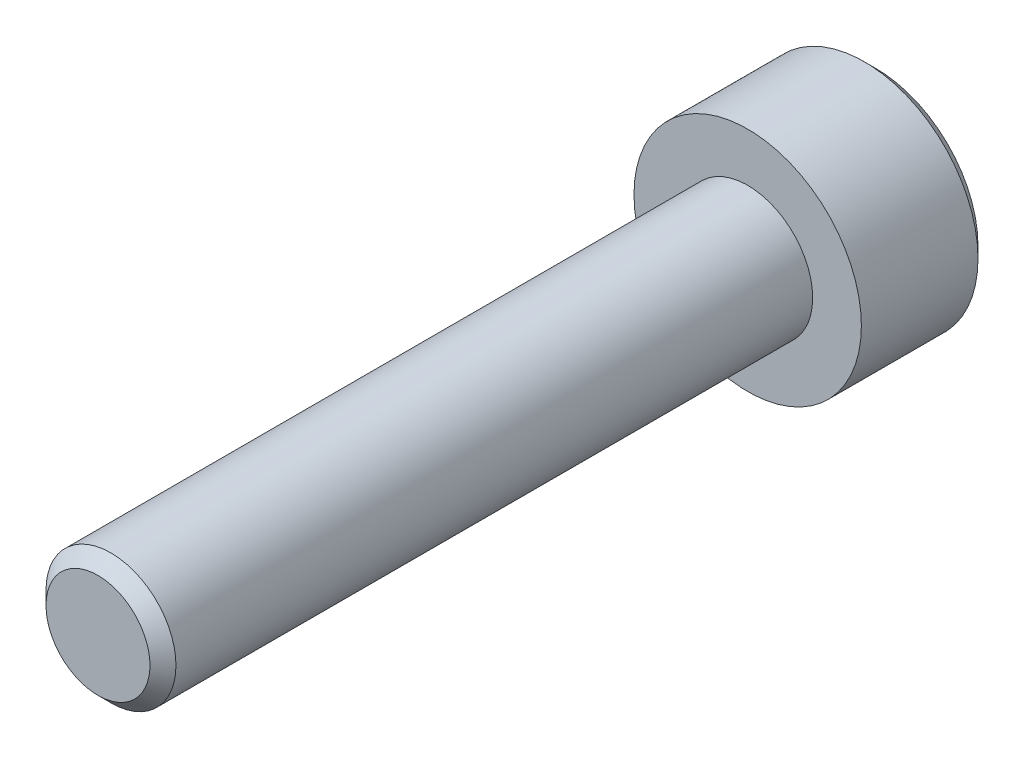
ISO-10303-21;
HEADER;
FILE_DESCRIPTION(('STEP AP214'),'2;1');
FILE_NAME('part.step','',(''),(''),'','','');
FILE_SCHEMA(('AUTOMOTIVE_DESIGN { 1 0 10303 214 1 1 1 1 }'));
ENDSEC;
DATA;
#1=APPLICATION_CONTEXT('core data for automotive mechanical design processes');
#2=APPLICATION_PROTOCOL_DEFINITION('international standard','automotive_design',2000,#1);
#3=PRODUCT_CONTEXT('',#1,'mechanical');
#4=PRODUCT('Part','Part','',(#3));
#5=PRODUCT_RELATED_PRODUCT_CATEGORY('part','',(#4));
#6=PRODUCT_DEFINITION_FORMATION('','',#4);
#7=PRODUCT_DEFINITION_CONTEXT('part definition',#1,'design');
#8=PRODUCT_DEFINITION('design','',#6,#7);
#9=PRODUCT_DEFINITION_SHAPE('','',#8);
#10=(LENGTH_UNIT() NAMED_UNIT(*) SI_UNIT(.MILLI.,.METRE.));
#11=(NAMED_UNIT(*) PLANE_ANGLE_UNIT() SI_UNIT($,.RADIAN.));
#12=(NAMED_UNIT(*) SI_UNIT($,.STERADIAN.) SOLID_ANGLE_UNIT());
#13=UNCERTAINTY_MEASURE_WITH_UNIT(LENGTH_MEASURE(1.E-05),#10,'distance_accuracy_value','');
#14=(GEOMETRIC_REPRESENTATION_CONTEXT(3) GLOBAL_UNCERTAINTY_ASSIGNED_CONTEXT((#13)) GLOBAL_UNIT_ASSIGNED_CONTEXT((#10,
#11,#12)) REPRESENTATION_CONTEXT('',''));
#15=CARTESIAN_POINT('',(0.,0.,0.));
#16=DIRECTION('',(0.,0.,1.));
#17=DIRECTION('',(1.,0.,0.));
#18=AXIS2_PLACEMENT_3D('',#15,#16,#17);
#19=CARTESIAN_POINT('',(0.,1.73205080756888,-3.94));
#20=DIRECTION('',(0.5,0.866025403784439,0.));
#21=DIRECTION('',(-0.866025403784439,0.5,0.));
#22=AXIS2_PLACEMENT_3D('',#19,#20,#21);
#23=PLANE('',#22);
#24=DIRECTION('',(-0.866025403784439,0.5,0.));
#25=VECTOR('',#24,1.);
#26=CARTESIAN_POINT('',(0.,1.73205080756888,-1.94));
#27=LINE('',#26,#25);
#28=CARTESIAN_POINT('',(0.,1.73205080756888,-1.94));
#29=VERTEX_POINT('',#28);
#30=CARTESIAN_POINT('',(1.5,0.86602540378444,-1.94));
#31=VERTEX_POINT('',#30);
#32=EDGE_CURVE('E66',#29,#31,#27,.F.);
#33=ORIENTED_EDGE('',*,*,#32,.F.);
#34=DIRECTION('',(0.,0.,1.));
#35=VECTOR('',#34,1.);
#36=CARTESIAN_POINT('',(0.,1.73205080756888,-3.94));
#37=LINE('',#36,#35);
#38=CARTESIAN_POINT('',(0.,1.73205080756888,-3.94));
#39=VERTEX_POINT('',#38);
#40=EDGE_CURVE('E87',#29,#39,#37,.F.);
#41=ORIENTED_EDGE('',*,*,#40,.T.);
#42=DIRECTION('',(-0.866025403784439,0.5,0.));
#43=VECTOR('',#42,1.);
#44=CARTESIAN_POINT('',(0.,1.73205080756888,-3.94));
#45=LINE('',#44,#43);
#46=CARTESIAN_POINT('',(1.5,0.866025403784439,-3.94));
#47=VERTEX_POINT('',#46);
#48=EDGE_CURVE('E75',#47,#39,#45,.T.);
#49=ORIENTED_EDGE('',*,*,#48,.F.);
#50=DIRECTION('',(0.,0.,-1.));
#51=VECTOR('',#50,1.);
#52=CARTESIAN_POINT('',(1.5,0.866025403784438,-3.94));
#53=LINE('',#52,#51);
#54=EDGE_CURVE('E82',#47,#31,#53,.F.);
#55=ORIENTED_EDGE('',*,*,#54,.T.);
#56=EDGE_LOOP('',(#33,#41,#49,#55));
#57=FACE_BOUND('',#56,.T.);
#58=ADVANCED_FACE('F17',(#57),#23,.F.);
#59=CARTESIAN_POINT('',(1.5,0.866025403784438,-3.94));
#60=DIRECTION('',(1.,0.,0.));
#61=DIRECTION('',(0.,0.,-1.));
#62=AXIS2_PLACEMENT_3D('',#59,#60,#61);
#63=PLANE('',#62);
#64=DIRECTION('',(0.,1.,0.));
#65=VECTOR('',#64,1.);
#66=CARTESIAN_POINT('',(1.5,0.866025403784438,-1.94));
#67=LINE('',#66,#65);
#68=CARTESIAN_POINT('',(1.5,-0.866025403784438,-1.94));
#69=VERTEX_POINT('',#68);
#70=EDGE_CURVE('E92',#31,#69,#67,.F.);
#71=ORIENTED_EDGE('',*,*,#70,.F.);
#72=ORIENTED_EDGE('',*,*,#54,.F.);
#73=DIRECTION('',(0.,1.,0.));
#74=VECTOR('',#73,1.);
#75=CARTESIAN_POINT('',(1.5,0.866025403784438,-3.94));
#76=LINE('',#75,#74);
#77=CARTESIAN_POINT('',(1.5,-0.866025403784438,-3.94));
#78=VERTEX_POINT('',#77);
#79=EDGE_CURVE('E71',#78,#47,#76,.T.);
#80=ORIENTED_EDGE('',*,*,#79,.F.);
#81=DIRECTION('',(0.,0.,1.));
#82=VECTOR('',#81,1.);
#83=CARTESIAN_POINT('',(1.5,-0.866025403784438,-3.94));
#84=LINE('',#83,#82);
#85=EDGE_CURVE('E154',#78,#69,#84,.T.);
#86=ORIENTED_EDGE('',*,*,#85,.T.);
#87=EDGE_LOOP('',(#71,#72,#80,#86));
#88=FACE_BOUND('',#87,.T.);
#89=ADVANCED_FACE('F91',(#88),#63,.F.);
#90=CARTESIAN_POINT('',(-1.5,0.866025403784438,-3.94));
#91=DIRECTION('',(-0.5,0.866025403784439,0.));
#92=DIRECTION('',(-0.866025403784439,-0.5,0.));
#93=AXIS2_PLACEMENT_3D('',#90,#91,#92);
#94=PLANE('',#93);
#95=DIRECTION('',(-0.866025403784438,-0.500000000000001,0.));
#96=VECTOR('',#95,1.);
#97=CARTESIAN_POINT('',(0.,1.73205080756888,-1.94));
#98=LINE('',#97,#96);
#99=CARTESIAN_POINT('',(-1.5,0.866025403784438,-1.94));
#100=VERTEX_POINT('',#99);
#101=EDGE_CURVE('E147',#29,#100,#98,.T.);
#102=ORIENTED_EDGE('',*,*,#101,.T.);
#103=DIRECTION('',(0.,0.,1.));
#104=VECTOR('',#103,1.);
#105=CARTESIAN_POINT('',(-1.5,0.866025403784438,-3.94));
#106=LINE('',#105,#104);
#107=CARTESIAN_POINT('',(-1.5,0.866025403784438,-3.94));
#108=VERTEX_POINT('',#107);
#109=EDGE_CURVE('E137',#100,#108,#106,.F.);
#110=ORIENTED_EDGE('',*,*,#109,.T.);
#111=DIRECTION('',(-0.866025403784439,-0.5,0.));
#112=VECTOR('',#111,1.);
#113=CARTESIAN_POINT('',(-1.5,0.866025403784438,-3.94));
#114=LINE('',#113,#112);
#115=EDGE_CURVE('E99',#39,#108,#114,.T.);
#116=ORIENTED_EDGE('',*,*,#115,.F.);
#117=ORIENTED_EDGE('',*,*,#40,.F.);
#118=EDGE_LOOP('',(#102,#110,#116,#117));
#119=FACE_BOUND('',#118,.T.);
#120=ADVANCED_FACE('F163',(#119),#94,.F.);
#121=CARTESIAN_POINT('',(1.5,-0.866025403784438,-3.94));
#122=DIRECTION('',(0.499999999999999,-0.866025403784439,0.));
#123=DIRECTION('',(0.866025403784439,0.499999999999999,0.));
#124=AXIS2_PLACEMENT_3D('',#121,#122,#123);
#125=PLANE('',#124);
#126=DIRECTION('',(0.866025403784438,0.500000000000001,0.));
#127=VECTOR('',#126,1.);
#128=CARTESIAN_POINT('',(0.,-1.73205080756888,-1.94));
#129=LINE('',#128,#127);
#130=CARTESIAN_POINT('',(0.,-1.73205080756888,-1.94));
#131=VERTEX_POINT('',#130);
#132=EDGE_CURVE('E150',#131,#69,#129,.T.);
#133=ORIENTED_EDGE('',*,*,#132,.T.);
#134=ORIENTED_EDGE('',*,*,#85,.F.);
#135=DIRECTION('',(0.866025403784439,0.499999999999999,0.));
#136=VECTOR('',#135,1.);
#137=CARTESIAN_POINT('',(1.5,-0.866025403784438,-3.94));
#138=LINE('',#137,#136);
#139=CARTESIAN_POINT('',(0.,-1.73205080756888,-3.94));
#140=VERTEX_POINT('',#139);
#141=EDGE_CURVE('E36',#140,#78,#138,.T.);
#142=ORIENTED_EDGE('',*,*,#141,.F.);
#143=DIRECTION('',(0.,0.,1.));
#144=VECTOR('',#143,1.);
#145=CARTESIAN_POINT('',(0.,-1.73205080756888,-3.94));
#146=LINE('',#145,#144);
#147=EDGE_CURVE('E134',#140,#131,#146,.T.);
#148=ORIENTED_EDGE('',*,*,#147,.T.);
#149=EDGE_LOOP('',(#133,#134,#142,#148));
#150=FACE_BOUND('',#149,.T.);
#151=ADVANCED_FACE('F172',(#150),#125,.F.);
#152=CARTESIAN_POINT('',(0.,0.,-1.94));
#153=DIRECTION('',(0.,0.,1.));
#154=DIRECTION('',(1.,0.,0.));
#155=AXIS2_PLACEMENT_3D('',#152,#153,#154);
#156=PLANE('',#155);
#157=ORIENTED_EDGE('',*,*,#101,.F.);
#158=ORIENTED_EDGE('',*,*,#32,.T.);
#159=ORIENTED_EDGE('',*,*,#70,.T.);
#160=ORIENTED_EDGE('',*,*,#132,.F.);
#161=DIRECTION('',(0.866025403784438,-0.5,0.));
#162=VECTOR('',#161,1.);
#163=CARTESIAN_POINT('',(0.,-1.73205080756888,-1.94));
#164=LINE('',#163,#162);
#165=CARTESIAN_POINT('',(-1.5,-0.866025403784439,-1.94));
#166=VERTEX_POINT('',#165);
#167=EDGE_CURVE('E131',#131,#166,#164,.F.);
#168=ORIENTED_EDGE('',*,*,#167,.T.);
#169=DIRECTION('',(0.,1.,0.));
#170=VECTOR('',#169,1.);
#171=CARTESIAN_POINT('',(-1.5,-0.866025403784438,-1.94));
#172=LINE('',#171,#170);
#173=EDGE_CURVE('E141',#166,#100,#172,.T.);
#174=ORIENTED_EDGE('',*,*,#173,.T.);
#175=EDGE_LOOP('',(#157,#158,#159,#160,#168,#174));
#176=FACE_BOUND('',#175,.T.);
#177=ADVANCED_FACE('F173',(#176),#156,.F.);
#178=CARTESIAN_POINT('',(-1.5,-0.866025403784438,-3.94));
#179=DIRECTION('',(-1.,0.,0.));
#180=DIRECTION('',(0.,0.,1.));
#181=AXIS2_PLACEMENT_3D('',#178,#179,#180);
#182=PLANE('',#181);
#183=ORIENTED_EDGE('',*,*,#173,.F.);
#184=DIRECTION('',(0.,0.,1.));
#185=VECTOR('',#184,1.);
#186=CARTESIAN_POINT('',(-1.5,-0.86602540378444,-3.94));
#187=LINE('',#186,#185);
#188=CARTESIAN_POINT('',(-1.5,-0.866025403784439,-3.94));
#189=VERTEX_POINT('',#188);
#190=EDGE_CURVE('E128',#166,#189,#187,.F.);
#191=ORIENTED_EDGE('',*,*,#190,.T.);
#192=DIRECTION('',(0.,1.,0.));
#193=VECTOR('',#192,1.);
#194=CARTESIAN_POINT('',(-1.5,-0.866025403784438,-3.94));
#195=LINE('',#194,#193);
#196=EDGE_CURVE('E145',#108,#189,#195,.F.);
#197=ORIENTED_EDGE('',*,*,#196,.F.);
#198=ORIENTED_EDGE('',*,*,#109,.F.);
#199=EDGE_LOOP('',(#183,#191,#197,#198));
#200=FACE_BOUND('',#199,.T.);
#201=ADVANCED_FACE('F166',(#200),#182,.F.);
#202=CARTESIAN_POINT('',(0.,-1.73205080756888,-3.94));
#203=DIRECTION('',(-0.5,-0.866025403784438,0.));
#204=DIRECTION('',(0.866025403784438,-0.5,0.));
#205=AXIS2_PLACEMENT_3D('',#202,#203,#204);
#206=PLANE('',#205);
#207=ORIENTED_EDGE('',*,*,#167,.F.);
#208=ORIENTED_EDGE('',*,*,#147,.F.);
#209=DIRECTION('',(-0.866025403784438,0.500000000000002,0.));
#210=VECTOR('',#209,1.);
#211=CARTESIAN_POINT('',(0.,-1.73205080756888,-3.94));
#212=LINE('',#211,#210);
#213=EDGE_CURVE('E122',#140,#189,#212,.T.);
#214=ORIENTED_EDGE('',*,*,#213,.T.);
#215=ORIENTED_EDGE('',*,*,#190,.F.);
#216=EDGE_LOOP('',(#207,#208,#214,#215));
#217=FACE_BOUND('',#216,.T.);
#218=ADVANCED_FACE('F170',(#217),#206,.F.);
#219=CARTESIAN_POINT('',(0.,0.,-3.94));
#220=DIRECTION('',(0.,0.,1.));
#221=DIRECTION('',(1.,0.,0.));
#222=AXIS2_PLACEMENT_3D('',#219,#220,#221);
#223=PLANE('',#222);
#224=ORIENTED_EDGE('',*,*,#141,.T.);
#225=ORIENTED_EDGE('',*,*,#79,.T.);
#226=ORIENTED_EDGE('',*,*,#48,.T.);
#227=ORIENTED_EDGE('',*,*,#115,.T.);
#228=ORIENTED_EDGE('',*,*,#196,.T.);
#229=ORIENTED_EDGE('',*,*,#213,.F.);
#230=EDGE_LOOP('',(#224,#225,#226,#227,#228,#229));
#231=FACE_BOUND('',#230,.T.);
#232=CARTESIAN_POINT('',(0.,0.,-3.9400000000569));
#233=DIRECTION('',(0.,0.,1.));
#234=DIRECTION('',(1.,0.,0.));
#235=AXIS2_PLACEMENT_3D('',#232,#233,#234);
#236=CIRCLE('',#235,3.14999999994825);
#237=CARTESIAN_POINT('',(3.14999999994825,0.,-3.9400000000569));
#238=VERTEX_POINT('',#237);
#239=EDGE_CURVE('E20',#238,#238,#236,.T.);
#240=ORIENTED_EDGE('',*,*,#239,.F.);
#241=EDGE_LOOP('',(#240));
#242=FACE_BOUND('',#241,.T.);
#243=ADVANCED_FACE('F73',(#231,#242),#223,.F.);
#244=CARTESIAN_POINT('',(0.,0.,-3.59000000003107));
#245=DIRECTION('',(0.,0.,1.));
#246=DIRECTION('',(1.,0.,0.));
#247=AXIS2_PLACEMENT_3D('',#244,#245,#246);
#248=CONICAL_SURFACE('',#247,3.49999999997408,0.785398163397448);
#249=ORIENTED_EDGE('',*,*,#239,.T.);
#250=EDGE_LOOP('',(#249));
#251=FACE_BOUND('',#250,.T.);
#252=CARTESIAN_POINT('',(0.,0.,-3.59));
#253=DIRECTION('',(0.,0.,1.));
#254=DIRECTION('',(1.,0.,0.));
#255=AXIS2_PLACEMENT_3D('',#252,#253,#254);
#256=CIRCLE('',#255,3.5);
#257=CARTESIAN_POINT('',(3.5,0.,-3.59));
#258=VERTEX_POINT('',#257);
#259=EDGE_CURVE('E111',#258,#258,#256,.T.);
#260=ORIENTED_EDGE('',*,*,#259,.F.);
#261=EDGE_LOOP('',(#260));
#262=FACE_BOUND('',#261,.T.);
#263=ADVANCED_FACE('F203',(#251,#262),#248,.T.);
#264=CARTESIAN_POINT('',(0.,0.,20.));
#265=DIRECTION('',(0.,0.,1.));
#266=DIRECTION('',(1.,0.,0.));
#267=AXIS2_PLACEMENT_3D('',#264,#265,#266);
#268=PLANE('',#267);
#269=CARTESIAN_POINT('',(0.,0.,20.0000000000387));
#270=DIRECTION('',(0.,0.,-1.));
#271=DIRECTION('',(-1.,0.,0.));
#272=AXIS2_PLACEMENT_3D('',#269,#270,#271);
#273=CIRCLE('',#272,1.59999999993943);
#274=CARTESIAN_POINT('',(-1.59999999993943,0.,20.0000000000387));
#275=VERTEX_POINT('',#274);
#276=EDGE_CURVE('E108',#275,#275,#273,.T.);
#277=ORIENTED_EDGE('',*,*,#276,.F.);
#278=EDGE_LOOP('',(#277));
#279=FACE_BOUND('',#278,.T.);
#280=ADVANCED_FACE('F200',(#279),#268,.T.);
#281=CARTESIAN_POINT('',(0.,0.,-3.94));
#282=DIRECTION('',(0.,0.,1.));
#283=DIRECTION('',(1.,0.,0.));
#284=AXIS2_PLACEMENT_3D('',#281,#282,#283);
#285=CYLINDRICAL_SURFACE('',#284,3.5);
#286=ORIENTED_EDGE('',*,*,#259,.T.);
#287=EDGE_LOOP('',(#286));
#288=FACE_BOUND('',#287,.T.);
#289=CARTESIAN_POINT('',(0.,0.,0.));
#290=DIRECTION('',(0.,0.,1.));
#291=DIRECTION('',(1.,0.,0.));
#292=AXIS2_PLACEMENT_3D('',#289,#290,#291);
#293=CIRCLE('',#292,3.5);
#294=CARTESIAN_POINT('',(3.5,0.,0.));
#295=VERTEX_POINT('',#294);
#296=EDGE_CURVE('E105',#295,#295,#293,.T.);
#297=ORIENTED_EDGE('',*,*,#296,.F.);
#298=EDGE_LOOP('',(#297));
#299=FACE_BOUND('',#298,.T.);
#300=ADVANCED_FACE('F196',(#288,#299),#285,.T.);
#301=CARTESIAN_POINT('',(0.,0.,19.5999999999685));
#302=DIRECTION('',(0.,0.,-1.));
#303=DIRECTION('',(-1.,0.,0.));
#304=AXIS2_PLACEMENT_3D('',#301,#302,#303);
#305=CONICAL_SURFACE('',#304,2.00000000000955,0.785398163397448);
#306=CARTESIAN_POINT('',(0.,0.,19.6));
#307=DIRECTION('',(0.,0.,1.));
#308=DIRECTION('',(1.,0.,0.));
#309=AXIS2_PLACEMENT_3D('',#306,#307,#308);
#310=CIRCLE('',#309,2.);
#311=CARTESIAN_POINT('',(2.,0.,19.6));
#312=VERTEX_POINT('',#311);
#313=EDGE_CURVE('E27',#312,#312,#310,.F.);
#314=ORIENTED_EDGE('',*,*,#313,.F.);
#315=EDGE_LOOP('',(#314));
#316=FACE_BOUND('',#315,.T.);
#317=ORIENTED_EDGE('',*,*,#276,.T.);
#318=EDGE_LOOP('',(#317));
#319=FACE_BOUND('',#318,.T.);
#320=ADVANCED_FACE('F189',(#316,#319),#305,.T.);
#321=CARTESIAN_POINT('',(0.,0.,0.));
#322=DIRECTION('',(0.,0.,1.));
#323=DIRECTION('',(1.,0.,0.));
#324=AXIS2_PLACEMENT_3D('',#321,#322,#323);
#325=PLANE('',#324);
#326=CARTESIAN_POINT('',(0.,0.,0.));
#327=DIRECTION('',(0.,0.,1.));
#328=DIRECTION('',(1.,0.,0.));
#329=AXIS2_PLACEMENT_3D('',#326,#327,#328);
#330=CIRCLE('',#329,2.);
#331=CARTESIAN_POINT('',(2.,0.,0.));
#332=VERTEX_POINT('',#331);
#333=EDGE_CURVE('E11',#332,#332,#330,.T.);
#334=ORIENTED_EDGE('',*,*,#333,.F.);
#335=EDGE_LOOP('',(#334));
#336=FACE_BOUND('',#335,.T.);
#337=ORIENTED_EDGE('',*,*,#296,.T.);
#338=EDGE_LOOP('',(#337));
#339=FACE_BOUND('',#338,.T.);
#340=ADVANCED_FACE('F184',(#336,#339),#325,.T.);
#341=CARTESIAN_POINT('',(0.,0.,0.));
#342=DIRECTION('',(0.,0.,1.));
#343=DIRECTION('',(1.,0.,0.));
#344=AXIS2_PLACEMENT_3D('',#341,#342,#343);
#345=CYLINDRICAL_SURFACE('',#344,2.);
#346=ORIENTED_EDGE('',*,*,#333,.T.);
#347=EDGE_LOOP('',(#346));
#348=FACE_BOUND('',#347,.T.);
#349=ORIENTED_EDGE('',*,*,#313,.T.);
#350=EDGE_LOOP('',(#349));
#351=FACE_BOUND('',#350,.T.);
#352=ADVANCED_FACE('F182',(#348,#351),#345,.T.);
#353=CLOSED_SHELL('',(#58,#89,#120,#151,#177,#201,#218,#243,#263,#280,#300,#320,#340,#352));
#354=MANIFOLD_SOLID_BREP('B1',#353);
#355=ADVANCED_BREP_SHAPE_REPRESENTATION('',(#18,#354),#14);
#356=SHAPE_DEFINITION_REPRESENTATION(#9,#355);
ENDSEC;
END-ISO-10303-21;
